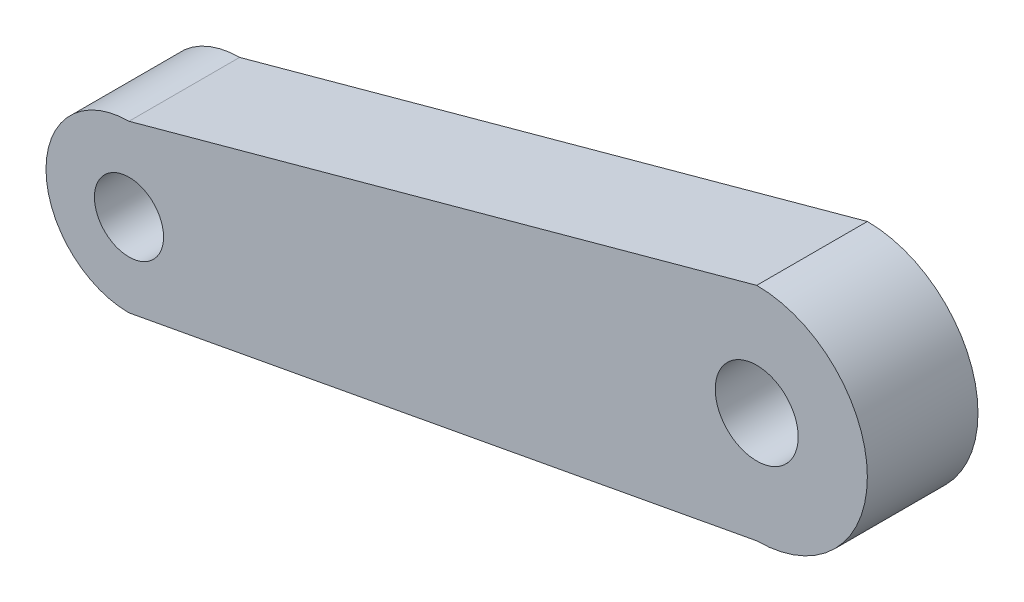
ISO-10303-21;
HEADER;
FILE_DESCRIPTION(('STEP AP214'),'2;1');
FILE_NAME('part.step','',(''),(''),'','','');
FILE_SCHEMA(('AUTOMOTIVE_DESIGN { 1 0 10303 214 1 1 1 1 }'));
ENDSEC;
DATA;
#1=APPLICATION_CONTEXT('core data for automotive mechanical design processes');
#2=APPLICATION_PROTOCOL_DEFINITION('international standard','automotive_design',2000,#1);
#3=PRODUCT_CONTEXT('',#1,'mechanical');
#4=PRODUCT('Part','Part','',(#3));
#5=PRODUCT_RELATED_PRODUCT_CATEGORY('part','',(#4));
#6=PRODUCT_DEFINITION_FORMATION('','',#4);
#7=PRODUCT_DEFINITION_CONTEXT('part definition',#1,'design');
#8=PRODUCT_DEFINITION('design','',#6,#7);
#9=PRODUCT_DEFINITION_SHAPE('','',#8);
#10=(LENGTH_UNIT() NAMED_UNIT(*) SI_UNIT(.MILLI.,.METRE.));
#11=(NAMED_UNIT(*) PLANE_ANGLE_UNIT() SI_UNIT($,.RADIAN.));
#12=(NAMED_UNIT(*) SI_UNIT($,.STERADIAN.) SOLID_ANGLE_UNIT());
#13=UNCERTAINTY_MEASURE_WITH_UNIT(LENGTH_MEASURE(1.E-05),#10,'distance_accuracy_value','');
#14=(GEOMETRIC_REPRESENTATION_CONTEXT(3) GLOBAL_UNCERTAINTY_ASSIGNED_CONTEXT((#13)) GLOBAL_UNIT_ASSIGNED_CONTEXT((#10,
#11,#12)) REPRESENTATION_CONTEXT('',''));
#15=CARTESIAN_POINT('',(0.,0.,0.));
#16=DIRECTION('',(0.,0.,1.));
#17=DIRECTION('',(1.,0.,0.));
#18=AXIS2_PLACEMENT_3D('',#15,#16,#17);
#19=CARTESIAN_POINT('',(-33.2939458034178,-8.67996554995853,8.));
#20=DIRECTION('',(0.,0.,1.));
#21=DIRECTION('',(1.,0.,0.));
#22=AXIS2_PLACEMENT_3D('',#19,#20,#21);
#23=PLANE('',#22);
#24=CARTESIAN_POINT('',(-33.2939458034178,-8.67996554995853,8.));
#25=DIRECTION('',(0.,0.,1.));
#26=DIRECTION('',(1.,0.,0.));
#27=AXIS2_PLACEMENT_3D('',#24,#25,#26);
#28=CIRCLE('',#27,2.5);
#29=CARTESIAN_POINT('',(-30.7939458034178,-8.67996554995853,8.));
#30=VERTEX_POINT('',#29);
#31=EDGE_CURVE('E98',#30,#30,#28,.T.);
#32=ORIENTED_EDGE('',*,*,#31,.F.);
#33=EDGE_LOOP('',(#32));
#34=FACE_BOUND('',#33,.T.);
#35=CARTESIAN_POINT('',(-33.2939458034178,-8.67996554995853,8.));
#36=DIRECTION('',(0.,0.,1.));
#37=DIRECTION('',(1.,0.,0.));
#38=AXIS2_PLACEMENT_3D('',#35,#36,#37);
#39=CIRCLE('',#38,6.00000000000021);
#40=CARTESIAN_POINT('',(-33.2939458034178,-2.67996554995832,8.));
#41=VERTEX_POINT('',#40);
#42=CARTESIAN_POINT('',(-33.2939458034178,-14.6799655499587,8.));
#43=VERTEX_POINT('',#42);
#44=EDGE_CURVE('E83',#41,#43,#39,.T.);
#45=ORIENTED_EDGE('',*,*,#44,.T.);
#46=DIRECTION('',(0.983227542693983,0.182383111301323,0.));
#47=VECTOR('',#46,1.);
#48=CARTESIAN_POINT('',(-33.2939458034178,-14.6799655499587,8.));
#49=LINE('',#48,#47);
#50=CARTESIAN_POINT('',(12.097120791572,-6.26018112427329,8.));
#51=VERTEX_POINT('',#50);
#52=EDGE_CURVE('E78',#43,#51,#49,.T.);
#53=ORIENTED_EDGE('',*,*,#52,.T.);
#54=CARTESIAN_POINT('',(12.097120791572,1.73981887572671,8.));
#55=DIRECTION('',(0.,0.,1.));
#56=DIRECTION('',(1.,0.,0.));
#57=AXIS2_PLACEMENT_3D('',#54,#55,#56);
#58=CIRCLE('',#57,8.);
#59=CARTESIAN_POINT('',(12.097120791572,9.73981887572671,8.));
#60=VERTEX_POINT('',#59);
#61=EDGE_CURVE('E81',#51,#60,#58,.T.);
#62=ORIENTED_EDGE('',*,*,#61,.T.);
#63=DIRECTION('',(-0.964545552499526,-0.263916420772532,0.));
#64=VECTOR('',#63,1.);
#65=CARTESIAN_POINT('',(-33.2939458034178,-2.67996554995832,8.));
#66=LINE('',#65,#64);
#67=EDGE_CURVE('E48',#60,#41,#66,.T.);
#68=ORIENTED_EDGE('',*,*,#67,.T.);
#69=EDGE_LOOP('',(#45,#53,#62,#68));
#70=FACE_BOUND('',#69,.T.);
#71=CARTESIAN_POINT('',(12.097120791572,1.73981887572671,8.));
#72=DIRECTION('',(0.,0.,1.));
#73=DIRECTION('',(1.,0.,0.));
#74=AXIS2_PLACEMENT_3D('',#71,#72,#73);
#75=CIRCLE('',#74,3.00000000000002);
#76=CARTESIAN_POINT('',(15.0971207915721,1.73981887572671,8.));
#77=VERTEX_POINT('',#76);
#78=EDGE_CURVE('E113',#77,#77,#75,.T.);
#79=ORIENTED_EDGE('',*,*,#78,.F.);
#80=EDGE_LOOP('',(#79));
#81=FACE_BOUND('',#80,.T.);
#82=ADVANCED_FACE('F31',(#34,#70,#81),#23,.T.);
#83=CARTESIAN_POINT('',(-33.2939458034178,-8.67996554995853,0.));
#84=DIRECTION('',(0.,0.,1.));
#85=DIRECTION('',(1.,0.,0.));
#86=AXIS2_PLACEMENT_3D('',#83,#84,#85);
#87=PLANE('',#86);
#88=CARTESIAN_POINT('',(-33.2939458034178,-8.67996554995853,0.));
#89=DIRECTION('',(0.,0.,1.));
#90=DIRECTION('',(1.,0.,0.));
#91=AXIS2_PLACEMENT_3D('',#88,#89,#90);
#92=CIRCLE('',#91,2.5);
#93=CARTESIAN_POINT('',(-30.7939458034178,-8.67996554995853,0.));
#94=VERTEX_POINT('',#93);
#95=EDGE_CURVE('E110',#94,#94,#92,.T.);
#96=ORIENTED_EDGE('',*,*,#95,.T.);
#97=EDGE_LOOP('',(#96));
#98=FACE_BOUND('',#97,.T.);
#99=CARTESIAN_POINT('',(-33.2939458034178,-8.67996554995853,0.));
#100=DIRECTION('',(0.,0.,1.));
#101=DIRECTION('',(1.,0.,0.));
#102=AXIS2_PLACEMENT_3D('',#99,#100,#101);
#103=CIRCLE('',#102,6.00000000000021);
#104=CARTESIAN_POINT('',(-33.2939458034178,-2.67996554995832,0.));
#105=VERTEX_POINT('',#104);
#106=CARTESIAN_POINT('',(-33.2939458034178,-14.6799655499587,0.));
#107=VERTEX_POINT('',#106);
#108=EDGE_CURVE('E95',#105,#107,#103,.T.);
#109=ORIENTED_EDGE('',*,*,#108,.F.);
#110=DIRECTION('',(-0.964545552499526,-0.263916420772532,0.));
#111=VECTOR('',#110,1.);
#112=CARTESIAN_POINT('',(-33.2939458034178,-2.67996554995832,0.));
#113=LINE('',#112,#111);
#114=CARTESIAN_POINT('',(12.097120791572,9.73981887572671,0.));
#115=VERTEX_POINT('',#114);
#116=EDGE_CURVE('E71',#115,#105,#113,.T.);
#117=ORIENTED_EDGE('',*,*,#116,.F.);
#118=CARTESIAN_POINT('',(12.097120791572,1.73981887572671,0.));
#119=DIRECTION('',(0.,0.,1.));
#120=DIRECTION('',(1.,0.,0.));
#121=AXIS2_PLACEMENT_3D('',#118,#119,#120);
#122=CIRCLE('',#121,8.);
#123=CARTESIAN_POINT('',(12.097120791572,-6.26018112427329,0.));
#124=VERTEX_POINT('',#123);
#125=EDGE_CURVE('E65',#124,#115,#122,.T.);
#126=ORIENTED_EDGE('',*,*,#125,.F.);
#127=DIRECTION('',(0.983227542693983,0.182383111301323,0.));
#128=VECTOR('',#127,1.);
#129=CARTESIAN_POINT('',(-33.2939458034178,-14.6799655499587,0.));
#130=LINE('',#129,#128);
#131=EDGE_CURVE('E87',#107,#124,#130,.T.);
#132=ORIENTED_EDGE('',*,*,#131,.F.);
#133=EDGE_LOOP('',(#109,#117,#126,#132));
#134=FACE_BOUND('',#133,.T.);
#135=CARTESIAN_POINT('',(12.097120791572,1.73981887572671,0.));
#136=DIRECTION('',(0.,0.,1.));
#137=DIRECTION('',(1.,0.,0.));
#138=AXIS2_PLACEMENT_3D('',#135,#136,#137);
#139=CIRCLE('',#138,3.00000000000002);
#140=CARTESIAN_POINT('',(15.0971207915721,1.73981887572671,0.));
#141=VERTEX_POINT('',#140);
#142=EDGE_CURVE('E116',#141,#141,#139,.T.);
#143=ORIENTED_EDGE('',*,*,#142,.T.);
#144=EDGE_LOOP('',(#143));
#145=FACE_BOUND('',#144,.T.);
#146=ADVANCED_FACE('F106',(#98,#134,#145),#87,.F.);
#147=CARTESIAN_POINT('',(-33.2939458034178,-8.67996554995853,8.));
#148=DIRECTION('',(0.,0.,-1.));
#149=DIRECTION('',(-1.,0.,0.));
#150=AXIS2_PLACEMENT_3D('',#147,#148,#149);
#151=CYLINDRICAL_SURFACE('',#150,6.00000000000021);
#152=ORIENTED_EDGE('',*,*,#108,.T.);
#153=DIRECTION('',(0.,0.,-1.));
#154=VECTOR('',#153,1.);
#155=CARTESIAN_POINT('',(-33.2939458034178,-14.6799655499587,8.));
#156=LINE('',#155,#154);
#157=EDGE_CURVE('E11',#43,#107,#156,.T.);
#158=ORIENTED_EDGE('',*,*,#157,.F.);
#159=ORIENTED_EDGE('',*,*,#44,.F.);
#160=DIRECTION('',(0.,0.,-1.));
#161=VECTOR('',#160,1.);
#162=CARTESIAN_POINT('',(-33.2939458034178,-2.67996554995832,8.));
#163=LINE('',#162,#161);
#164=EDGE_CURVE('E91',#41,#105,#163,.T.);
#165=ORIENTED_EDGE('',*,*,#164,.T.);
#166=EDGE_LOOP('',(#152,#158,#159,#165));
#167=FACE_BOUND('',#166,.T.);
#168=ADVANCED_FACE('F33',(#167),#151,.T.);
#169=CARTESIAN_POINT('',(-33.2939458034178,-14.6799655499587,8.));
#170=DIRECTION('',(-0.182383111301323,0.983227542693984,0.));
#171=DIRECTION('',(-0.983227542693984,-0.182383111301323,0.));
#172=AXIS2_PLACEMENT_3D('',#169,#170,#171);
#173=PLANE('',#172);
#174=ORIENTED_EDGE('',*,*,#131,.T.);
#175=DIRECTION('',(0.,0.,-1.));
#176=VECTOR('',#175,1.);
#177=CARTESIAN_POINT('',(12.097120791572,-6.26018112427329,8.));
#178=LINE('',#177,#176);
#179=EDGE_CURVE('E40',#51,#124,#178,.T.);
#180=ORIENTED_EDGE('',*,*,#179,.F.);
#181=ORIENTED_EDGE('',*,*,#52,.F.);
#182=ORIENTED_EDGE('',*,*,#157,.T.);
#183=EDGE_LOOP('',(#174,#180,#181,#182));
#184=FACE_BOUND('',#183,.T.);
#185=ADVANCED_FACE('F86',(#184),#173,.F.);
#186=CARTESIAN_POINT('',(12.097120791572,1.73981887572671,8.));
#187=DIRECTION('',(0.,0.,-1.));
#188=DIRECTION('',(-1.,0.,0.));
#189=AXIS2_PLACEMENT_3D('',#186,#187,#188);
#190=CYLINDRICAL_SURFACE('',#189,8.);
#191=ORIENTED_EDGE('',*,*,#125,.T.);
#192=DIRECTION('',(0.,0.,-1.));
#193=VECTOR('',#192,1.);
#194=CARTESIAN_POINT('',(12.097120791572,9.73981887572671,8.));
#195=LINE('',#194,#193);
#196=EDGE_CURVE('E88',#60,#115,#195,.T.);
#197=ORIENTED_EDGE('',*,*,#196,.F.);
#198=ORIENTED_EDGE('',*,*,#61,.F.);
#199=ORIENTED_EDGE('',*,*,#179,.T.);
#200=EDGE_LOOP('',(#191,#197,#198,#199));
#201=FACE_BOUND('',#200,.T.);
#202=ADVANCED_FACE('F89',(#201),#190,.T.);
#203=CARTESIAN_POINT('',(-33.2939458034178,-2.67996554995832,8.));
#204=DIRECTION('',(0.263916420772532,-0.964545552499526,0.));
#205=DIRECTION('',(0.964545552499526,0.263916420772532,0.));
#206=AXIS2_PLACEMENT_3D('',#203,#204,#205);
#207=PLANE('',#206);
#208=ORIENTED_EDGE('',*,*,#116,.T.);
#209=ORIENTED_EDGE('',*,*,#164,.F.);
#210=ORIENTED_EDGE('',*,*,#67,.F.);
#211=ORIENTED_EDGE('',*,*,#196,.T.);
#212=EDGE_LOOP('',(#208,#209,#210,#211));
#213=FACE_BOUND('',#212,.T.);
#214=ADVANCED_FACE('F103',(#213),#207,.F.);
#215=CARTESIAN_POINT('',(-33.2939458034178,-8.67996554995853,8.));
#216=DIRECTION('',(0.,0.,-1.));
#217=DIRECTION('',(-1.,0.,0.));
#218=AXIS2_PLACEMENT_3D('',#215,#216,#217);
#219=CYLINDRICAL_SURFACE('',#218,2.5);
#220=ORIENTED_EDGE('',*,*,#31,.T.);
#221=EDGE_LOOP('',(#220));
#222=FACE_BOUND('',#221,.T.);
#223=ORIENTED_EDGE('',*,*,#95,.F.);
#224=EDGE_LOOP('',(#223));
#225=FACE_BOUND('',#224,.T.);
#226=ADVANCED_FACE('F134',(#222,#225),#219,.F.);
#227=CARTESIAN_POINT('',(12.097120791572,1.73981887572671,8.));
#228=DIRECTION('',(0.,0.,-1.));
#229=DIRECTION('',(-1.,0.,0.));
#230=AXIS2_PLACEMENT_3D('',#227,#228,#229);
#231=CYLINDRICAL_SURFACE('',#230,3.00000000000002);
#232=ORIENTED_EDGE('',*,*,#78,.T.);
#233=EDGE_LOOP('',(#232));
#234=FACE_BOUND('',#233,.T.);
#235=ORIENTED_EDGE('',*,*,#142,.F.);
#236=EDGE_LOOP('',(#235));
#237=FACE_BOUND('',#236,.T.);
#238=ADVANCED_FACE('F122',(#234,#237),#231,.F.);
#239=CLOSED_SHELL('',(#82,#146,#168,#185,#202,#214,#226,#238));
#240=MANIFOLD_SOLID_BREP('B2',#239);
#241=ADVANCED_BREP_SHAPE_REPRESENTATION('',(#18,#240),#14);
#242=SHAPE_DEFINITION_REPRESENTATION(#9,#241);
ENDSEC;
END-ISO-10303-21;
